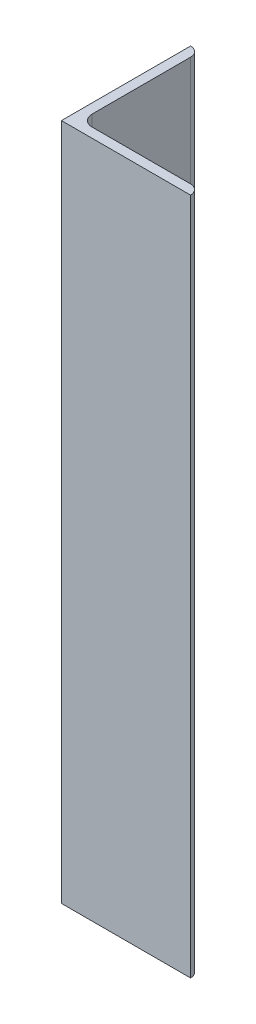
ISO-10303-21;
HEADER;
FILE_DESCRIPTION(('STEP AP214'),'2;1');
FILE_NAME('part.step','',(''),(''),'','','');
FILE_SCHEMA(('AUTOMOTIVE_DESIGN { 1 0 10303 214 1 1 1 1 }'));
ENDSEC;
DATA;
#1=APPLICATION_CONTEXT('core data for automotive mechanical design processes');
#2=APPLICATION_PROTOCOL_DEFINITION('international standard','automotive_design',2000,#1);
#3=PRODUCT_CONTEXT('',#1,'mechanical');
#4=PRODUCT('Part','Part','',(#3));
#5=PRODUCT_RELATED_PRODUCT_CATEGORY('part','',(#4));
#6=PRODUCT_DEFINITION_FORMATION('','',#4);
#7=PRODUCT_DEFINITION_CONTEXT('part definition',#1,'design');
#8=PRODUCT_DEFINITION('design','',#6,#7);
#9=PRODUCT_DEFINITION_SHAPE('','',#8);
#10=(LENGTH_UNIT() NAMED_UNIT(*) SI_UNIT(.MILLI.,.METRE.));
#11=(NAMED_UNIT(*) PLANE_ANGLE_UNIT() SI_UNIT($,.RADIAN.));
#12=(NAMED_UNIT(*) SI_UNIT($,.STERADIAN.) SOLID_ANGLE_UNIT());
#13=UNCERTAINTY_MEASURE_WITH_UNIT(LENGTH_MEASURE(1.E-05),#10,'distance_accuracy_value','');
#14=(GEOMETRIC_REPRESENTATION_CONTEXT(3) GLOBAL_UNCERTAINTY_ASSIGNED_CONTEXT((#13)) GLOBAL_UNIT_ASSIGNED_CONTEXT((#10,
#11,#12)) REPRESENTATION_CONTEXT('',''));
#15=CARTESIAN_POINT('',(0.,0.,0.));
#16=DIRECTION('',(0.,0.,1.));
#17=DIRECTION('',(1.,0.,0.));
#18=AXIS2_PLACEMENT_3D('',#15,#16,#17);
#19=CARTESIAN_POINT('',(40.,210.,0.));
#20=DIRECTION('',(0.,0.,-1.));
#21=DIRECTION('',(-1.,0.,0.));
#22=AXIS2_PLACEMENT_3D('',#19,#20,#21);
#23=PLANE('',#22);
#24=DIRECTION('',(1.,0.,0.));
#25=VECTOR('',#24,1.);
#26=CARTESIAN_POINT('',(40.,0.,0.));
#27=LINE('',#26,#25);
#28=CARTESIAN_POINT('',(0.,0.,0.));
#29=VERTEX_POINT('',#28);
#30=CARTESIAN_POINT('',(40.,0.,0.));
#31=VERTEX_POINT('',#30);
#32=EDGE_CURVE('E160',#29,#31,#27,.T.);
#33=ORIENTED_EDGE('',*,*,#32,.T.);
#34=DIRECTION('',(0.,-1.,0.));
#35=VECTOR('',#34,1.);
#36=CARTESIAN_POINT('',(40.,210.,0.));
#37=LINE('',#36,#35);
#38=CARTESIAN_POINT('',(40.,210.,0.));
#39=VERTEX_POINT('',#38);
#40=EDGE_CURVE('E13',#39,#31,#37,.T.);
#41=ORIENTED_EDGE('',*,*,#40,.F.);
#42=DIRECTION('',(1.,0.,0.));
#43=VECTOR('',#42,1.);
#44=CARTESIAN_POINT('',(40.,210.,0.));
#45=LINE('',#44,#43);
#46=CARTESIAN_POINT('',(0.,210.,0.));
#47=VERTEX_POINT('',#46);
#48=EDGE_CURVE('E179',#47,#39,#45,.T.);
#49=ORIENTED_EDGE('',*,*,#48,.F.);
#50=DIRECTION('',(0.,-1.,0.));
#51=VECTOR('',#50,1.);
#52=CARTESIAN_POINT('',(0.,210.,0.));
#53=LINE('',#52,#51);
#54=EDGE_CURVE('E156',#47,#29,#53,.T.);
#55=ORIENTED_EDGE('',*,*,#54,.T.);
#56=EDGE_LOOP('',(#33,#41,#49,#55));
#57=FACE_BOUND('',#56,.T.);
#58=ADVANCED_FACE('F65',(#57),#23,.F.);
#59=CARTESIAN_POINT('',(37.,210.,0.));
#60=DIRECTION('',(0.,-1.,0.));
#61=DIRECTION('',(0.,0.,-1.));
#62=AXIS2_PLACEMENT_3D('',#59,#60,#61);
#63=CYLINDRICAL_SURFACE('',#62,3.00000000000001);
#64=CARTESIAN_POINT('',(37.,0.,0.));
#65=DIRECTION('',(0.,1.,0.));
#66=DIRECTION('',(0.,0.,1.));
#67=AXIS2_PLACEMENT_3D('',#64,#65,#66);
#68=CIRCLE('',#67,3.00000000000001);
#69=CARTESIAN_POINT('',(37.,0.,-3.));
#70=VERTEX_POINT('',#69);
#71=EDGE_CURVE('E164',#31,#70,#68,.T.);
#72=ORIENTED_EDGE('',*,*,#71,.T.);
#73=DIRECTION('',(0.,-1.,0.));
#74=VECTOR('',#73,1.);
#75=CARTESIAN_POINT('',(37.,210.,-3.));
#76=LINE('',#75,#74);
#77=CARTESIAN_POINT('',(37.,210.,-3.));
#78=VERTEX_POINT('',#77);
#79=EDGE_CURVE('E74',#78,#70,#76,.T.);
#80=ORIENTED_EDGE('',*,*,#79,.F.);
#81=CARTESIAN_POINT('',(37.,210.,0.));
#82=DIRECTION('',(0.,1.,0.));
#83=DIRECTION('',(0.,0.,1.));
#84=AXIS2_PLACEMENT_3D('',#81,#82,#83);
#85=CIRCLE('',#84,3.00000000000001);
#86=EDGE_CURVE('E122',#39,#78,#85,.T.);
#87=ORIENTED_EDGE('',*,*,#86,.F.);
#88=ORIENTED_EDGE('',*,*,#40,.T.);
#89=EDGE_LOOP('',(#72,#80,#87,#88));
#90=FACE_BOUND('',#89,.T.);
#91=ADVANCED_FACE('F213',(#90),#63,.T.);
#92=CARTESIAN_POINT('',(6.5,210.,-3.));
#93=DIRECTION('',(0.,0.,1.));
#94=DIRECTION('',(1.,0.,0.));
#95=AXIS2_PLACEMENT_3D('',#92,#93,#94);
#96=PLANE('',#95);
#97=DIRECTION('',(-1.,0.,0.));
#98=VECTOR('',#97,1.);
#99=CARTESIAN_POINT('',(6.5,0.,-3.));
#100=LINE('',#99,#98);
#101=CARTESIAN_POINT('',(6.5,0.,-3.));
#102=VERTEX_POINT('',#101);
#103=EDGE_CURVE('E167',#70,#102,#100,.T.);
#104=ORIENTED_EDGE('',*,*,#103,.T.);
#105=DIRECTION('',(0.,-1.,0.));
#106=VECTOR('',#105,1.);
#107=CARTESIAN_POINT('',(6.5,210.,-3.));
#108=LINE('',#107,#106);
#109=CARTESIAN_POINT('',(6.5,210.,-3.));
#110=VERTEX_POINT('',#109);
#111=EDGE_CURVE('E186',#110,#102,#108,.T.);
#112=ORIENTED_EDGE('',*,*,#111,.F.);
#113=DIRECTION('',(-1.,0.,0.));
#114=VECTOR('',#113,1.);
#115=CARTESIAN_POINT('',(6.5,210.,-3.));
#116=LINE('',#115,#114);
#117=EDGE_CURVE('E196',#78,#110,#116,.T.);
#118=ORIENTED_EDGE('',*,*,#117,.F.);
#119=ORIENTED_EDGE('',*,*,#79,.T.);
#120=EDGE_LOOP('',(#104,#112,#118,#119));
#121=FACE_BOUND('',#120,.T.);
#122=ADVANCED_FACE('F194',(#121),#96,.F.);
#123=CARTESIAN_POINT('',(6.5,210.,-6.5));
#124=DIRECTION('',(0.,-1.,0.));
#125=DIRECTION('',(0.,0.,-1.));
#126=AXIS2_PLACEMENT_3D('',#123,#124,#125);
#127=CYLINDRICAL_SURFACE('',#126,3.5);
#128=CARTESIAN_POINT('',(6.5,0.,-6.5));
#129=DIRECTION('',(0.,-1.,0.));
#130=DIRECTION('',(0.,0.,-1.));
#131=AXIS2_PLACEMENT_3D('',#128,#129,#130);
#132=CIRCLE('',#131,3.5);
#133=CARTESIAN_POINT('',(3.,0.,-6.5));
#134=VERTEX_POINT('',#133);
#135=EDGE_CURVE('E170',#102,#134,#132,.T.);
#136=ORIENTED_EDGE('',*,*,#135,.T.);
#137=DIRECTION('',(0.,-1.,0.));
#138=VECTOR('',#137,1.);
#139=CARTESIAN_POINT('',(3.,210.,-6.5));
#140=LINE('',#139,#138);
#141=CARTESIAN_POINT('',(3.,210.,-6.5));
#142=VERTEX_POINT('',#141);
#143=EDGE_CURVE('E149',#142,#134,#140,.T.);
#144=ORIENTED_EDGE('',*,*,#143,.F.);
#145=CARTESIAN_POINT('',(6.5,210.,-6.5));
#146=DIRECTION('',(0.,-1.,0.));
#147=DIRECTION('',(0.,0.,-1.));
#148=AXIS2_PLACEMENT_3D('',#145,#146,#147);
#149=CIRCLE('',#148,3.5);
#150=EDGE_CURVE('E138',#110,#142,#149,.T.);
#151=ORIENTED_EDGE('',*,*,#150,.F.);
#152=ORIENTED_EDGE('',*,*,#111,.T.);
#153=EDGE_LOOP('',(#136,#144,#151,#152));
#154=FACE_BOUND('',#153,.T.);
#155=ADVANCED_FACE('F202',(#154),#127,.F.);
#156=CARTESIAN_POINT('',(3.,210.,-37.));
#157=DIRECTION('',(-1.,0.,0.));
#158=DIRECTION('',(0.,0.,1.));
#159=AXIS2_PLACEMENT_3D('',#156,#157,#158);
#160=PLANE('',#159);
#161=DIRECTION('',(0.,0.,-1.));
#162=VECTOR('',#161,1.);
#163=CARTESIAN_POINT('',(3.,0.,-37.));
#164=LINE('',#163,#162);
#165=CARTESIAN_POINT('',(3.,0.,-37.));
#166=VERTEX_POINT('',#165);
#167=EDGE_CURVE('E147',#134,#166,#164,.T.);
#168=ORIENTED_EDGE('',*,*,#167,.T.);
#169=DIRECTION('',(0.,-1.,0.));
#170=VECTOR('',#169,1.);
#171=CARTESIAN_POINT('',(3.,210.,-37.));
#172=LINE('',#171,#170);
#173=CARTESIAN_POINT('',(3.,210.,-37.));
#174=VERTEX_POINT('',#173);
#175=EDGE_CURVE('E144',#174,#166,#172,.T.);
#176=ORIENTED_EDGE('',*,*,#175,.F.);
#177=DIRECTION('',(0.,0.,-1.));
#178=VECTOR('',#177,1.);
#179=CARTESIAN_POINT('',(3.,210.,-37.));
#180=LINE('',#179,#178);
#181=EDGE_CURVE('E132',#142,#174,#180,.T.);
#182=ORIENTED_EDGE('',*,*,#181,.F.);
#183=ORIENTED_EDGE('',*,*,#143,.T.);
#184=EDGE_LOOP('',(#168,#176,#182,#183));
#185=FACE_BOUND('',#184,.T.);
#186=ADVANCED_FACE('F145',(#185),#160,.F.);
#187=CARTESIAN_POINT('',(0.,210.,-37.));
#188=DIRECTION('',(0.,-1.,0.));
#189=DIRECTION('',(0.,0.,-1.));
#190=AXIS2_PLACEMENT_3D('',#187,#188,#189);
#191=CYLINDRICAL_SURFACE('',#190,3.);
#192=CARTESIAN_POINT('',(0.,0.,-37.));
#193=DIRECTION('',(0.,1.,0.));
#194=DIRECTION('',(0.,0.,-1.));
#195=AXIS2_PLACEMENT_3D('',#192,#193,#194);
#196=CIRCLE('',#195,3.);
#197=CARTESIAN_POINT('',(0.,0.,-40.));
#198=VERTEX_POINT('',#197);
#199=EDGE_CURVE('E108',#166,#198,#196,.T.);
#200=ORIENTED_EDGE('',*,*,#199,.T.);
#201=DIRECTION('',(0.,-1.,0.));
#202=VECTOR('',#201,1.);
#203=CARTESIAN_POINT('',(0.,210.,-40.));
#204=LINE('',#203,#202);
#205=CARTESIAN_POINT('',(0.,210.,-40.));
#206=VERTEX_POINT('',#205);
#207=EDGE_CURVE('E150',#206,#198,#204,.T.);
#208=ORIENTED_EDGE('',*,*,#207,.F.);
#209=CARTESIAN_POINT('',(0.,210.,-37.));
#210=DIRECTION('',(0.,1.,0.));
#211=DIRECTION('',(0.,0.,-1.));
#212=AXIS2_PLACEMENT_3D('',#209,#210,#211);
#213=CIRCLE('',#212,3.);
#214=EDGE_CURVE('E136',#174,#206,#213,.T.);
#215=ORIENTED_EDGE('',*,*,#214,.F.);
#216=ORIENTED_EDGE('',*,*,#175,.T.);
#217=EDGE_LOOP('',(#200,#208,#215,#216));
#218=FACE_BOUND('',#217,.T.);
#219=ADVANCED_FACE('F152',(#218),#191,.T.);
#220=CARTESIAN_POINT('',(0.,210.,0.));
#221=DIRECTION('',(1.,0.,0.));
#222=DIRECTION('',(0.,0.,-1.));
#223=AXIS2_PLACEMENT_3D('',#220,#221,#222);
#224=PLANE('',#223);
#225=DIRECTION('',(0.,0.,1.));
#226=VECTOR('',#225,1.);
#227=CARTESIAN_POINT('',(0.,0.,0.));
#228=LINE('',#227,#226);
#229=EDGE_CURVE('E114',#198,#29,#228,.T.);
#230=ORIENTED_EDGE('',*,*,#229,.T.);
#231=ORIENTED_EDGE('',*,*,#54,.F.);
#232=DIRECTION('',(0.,0.,1.));
#233=VECTOR('',#232,1.);
#234=CARTESIAN_POINT('',(0.,210.,0.));
#235=LINE('',#234,#233);
#236=EDGE_CURVE('E82',#206,#47,#235,.T.);
#237=ORIENTED_EDGE('',*,*,#236,.F.);
#238=ORIENTED_EDGE('',*,*,#207,.T.);
#239=EDGE_LOOP('',(#230,#231,#237,#238));
#240=FACE_BOUND('',#239,.T.);
#241=ADVANCED_FACE('F227',(#240),#224,.F.);
#242=CARTESIAN_POINT('',(0.,210.,-37.));
#243=DIRECTION('',(0.,-1.,0.));
#244=DIRECTION('',(0.,0.,-1.));
#245=AXIS2_PLACEMENT_3D('',#242,#243,#244);
#246=PLANE('',#245);
#247=ORIENTED_EDGE('',*,*,#48,.T.);
#248=ORIENTED_EDGE('',*,*,#86,.T.);
#249=ORIENTED_EDGE('',*,*,#117,.T.);
#250=ORIENTED_EDGE('',*,*,#150,.T.);
#251=ORIENTED_EDGE('',*,*,#181,.T.);
#252=ORIENTED_EDGE('',*,*,#214,.T.);
#253=ORIENTED_EDGE('',*,*,#236,.T.);
#254=EDGE_LOOP('',(#247,#248,#249,#250,#251,#252,#253));
#255=FACE_BOUND('',#254,.T.);
#256=ADVANCED_FACE('F134',(#255),#246,.F.);
#257=CARTESIAN_POINT('',(0.,0.,-37.));
#258=DIRECTION('',(0.,-1.,0.));
#259=DIRECTION('',(0.,0.,-1.));
#260=AXIS2_PLACEMENT_3D('',#257,#258,#259);
#261=PLANE('',#260);
#262=ORIENTED_EDGE('',*,*,#32,.F.);
#263=ORIENTED_EDGE('',*,*,#229,.F.);
#264=ORIENTED_EDGE('',*,*,#199,.F.);
#265=ORIENTED_EDGE('',*,*,#167,.F.);
#266=ORIENTED_EDGE('',*,*,#135,.F.);
#267=ORIENTED_EDGE('',*,*,#103,.F.);
#268=ORIENTED_EDGE('',*,*,#71,.F.);
#269=EDGE_LOOP('',(#262,#263,#264,#265,#266,#267,#268));
#270=FACE_BOUND('',#269,.T.);
#271=ADVANCED_FACE('F200',(#270),#261,.T.);
#272=CLOSED_SHELL('',(#58,#91,#122,#155,#186,#219,#241,#256,#271));
#273=MANIFOLD_SOLID_BREP('B2',#272);
#274=ADVANCED_BREP_SHAPE_REPRESENTATION('',(#18,#273),#14);
#275=SHAPE_DEFINITION_REPRESENTATION(#9,#274);
ENDSEC;
END-ISO-10303-21;
